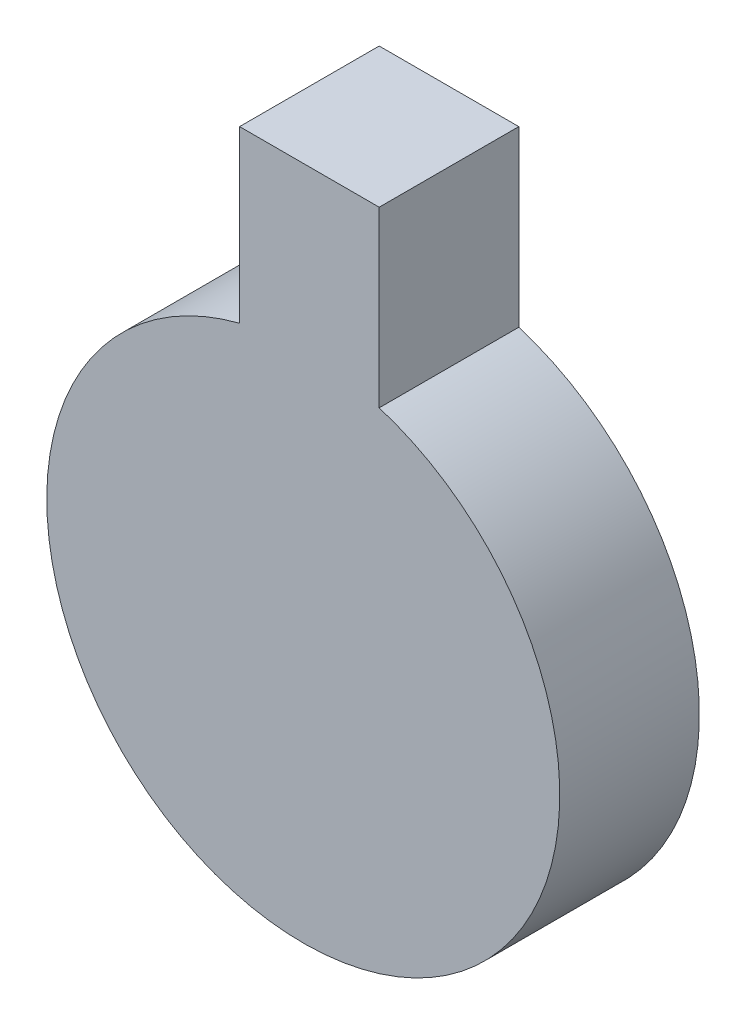
ISO-10303-21;
HEADER;
FILE_DESCRIPTION(('STEP AP214'),'2;1');
FILE_NAME('part.step','',(''),(''),'','','');
FILE_SCHEMA(('AUTOMOTIVE_DESIGN { 1 0 10303 214 1 1 1 1 }'));
ENDSEC;
DATA;
#1=APPLICATION_CONTEXT('core data for automotive mechanical design processes');
#2=APPLICATION_PROTOCOL_DEFINITION('international standard','automotive_design',2000,#1);
#3=PRODUCT_CONTEXT('',#1,'mechanical');
#4=PRODUCT('Part','Part','',(#3));
#5=PRODUCT_RELATED_PRODUCT_CATEGORY('part','',(#4));
#6=PRODUCT_DEFINITION_FORMATION('','',#4);
#7=PRODUCT_DEFINITION_CONTEXT('part definition',#1,'design');
#8=PRODUCT_DEFINITION('design','',#6,#7);
#9=PRODUCT_DEFINITION_SHAPE('','',#8);
#10=(LENGTH_UNIT() NAMED_UNIT(*) SI_UNIT(.MILLI.,.METRE.));
#11=(NAMED_UNIT(*) PLANE_ANGLE_UNIT() SI_UNIT($,.RADIAN.));
#12=(NAMED_UNIT(*) SI_UNIT($,.STERADIAN.) SOLID_ANGLE_UNIT());
#13=UNCERTAINTY_MEASURE_WITH_UNIT(LENGTH_MEASURE(1.E-05),#10,'distance_accuracy_value','');
#14=(GEOMETRIC_REPRESENTATION_CONTEXT(3) GLOBAL_UNCERTAINTY_ASSIGNED_CONTEXT((#13)) GLOBAL_UNIT_ASSIGNED_CONTEXT((#10,
#11,#12)) REPRESENTATION_CONTEXT('',''));
#15=CARTESIAN_POINT('',(0.,0.,0.));
#16=DIRECTION('',(0.,0.,1.));
#17=DIRECTION('',(1.,0.,0.));
#18=AXIS2_PLACEMENT_3D('',#15,#16,#17);
#19=CARTESIAN_POINT('',(0.,0.,0.04));
#20=DIRECTION('',(0.,0.,-1.));
#21=DIRECTION('',(-1.,0.,0.));
#22=AXIS2_PLACEMENT_3D('',#19,#20,#21);
#23=CYLINDRICAL_SURFACE('',#22,0.0734999995823187);
#24=DIRECTION('',(0.,0.,-1.));
#25=VECTOR('',#24,1.);
#26=CARTESIAN_POINT('',(-0.018243595957756,0.0711998675920889,0.04));
#27=LINE('',#26,#25);
#28=CARTESIAN_POINT('',(-0.018243595957756,0.0711998675920889,-8.94069676149814E-10));
#29=VERTEX_POINT('',#28);
#30=CARTESIAN_POINT('',(-0.018243595957756,0.0711998675920889,0.04));
#31=VERTEX_POINT('',#30);
#32=EDGE_CURVE('E91',#29,#31,#27,.F.);
#33=ORIENTED_EDGE('',*,*,#32,.F.);
#34=CARTESIAN_POINT('',(0.,0.,0.));
#35=DIRECTION('',(0.,0.,1.));
#36=DIRECTION('',(1.,0.,0.));
#37=AXIS2_PLACEMENT_3D('',#34,#35,#36);
#38=CIRCLE('',#37,0.0734999995823187);
#39=CARTESIAN_POINT('',(0.021756404042244,0.0702061879163901,0.));
#40=VERTEX_POINT('',#39);
#41=EDGE_CURVE('E36',#29,#40,#38,.T.);
#42=ORIENTED_EDGE('',*,*,#41,.T.);
#43=DIRECTION('',(0.,0.,-1.));
#44=VECTOR('',#43,1.);
#45=CARTESIAN_POINT('',(0.021756404042244,0.0702061879163901,0.04));
#46=LINE('',#45,#44);
#47=CARTESIAN_POINT('',(0.021756404042244,0.0702061879163901,0.04));
#48=VERTEX_POINT('',#47);
#49=EDGE_CURVE('E50',#48,#40,#46,.T.);
#50=ORIENTED_EDGE('',*,*,#49,.F.);
#51=CARTESIAN_POINT('',(0.,0.,0.04));
#52=DIRECTION('',(0.,0.,1.));
#53=DIRECTION('',(1.,0.,0.));
#54=AXIS2_PLACEMENT_3D('',#51,#52,#53);
#55=CIRCLE('',#54,0.0734999995823187);
#56=EDGE_CURVE('E11',#31,#48,#55,.T.);
#57=ORIENTED_EDGE('',*,*,#56,.F.);
#58=EDGE_LOOP('',(#33,#42,#50,#57));
#59=FACE_BOUND('',#58,.T.);
#60=ADVANCED_FACE('F33',(#59),#23,.T.);
#61=CARTESIAN_POINT('',(0.,0.,0.04));
#62=DIRECTION('',(0.,0.,1.));
#63=DIRECTION('',(1.,0.,0.));
#64=AXIS2_PLACEMENT_3D('',#61,#62,#63);
#65=PLANE('',#64);
#66=ORIENTED_EDGE('',*,*,#56,.T.);
#67=DIRECTION('',(0.,-1.,0.));
#68=VECTOR('',#67,1.);
#69=CARTESIAN_POINT('',(0.021756404042244,0.12,0.0399999991059303));
#70=LINE('',#69,#68);
#71=CARTESIAN_POINT('',(0.021756404042244,0.12,0.0399999991059303));
#72=VERTEX_POINT('',#71);
#73=EDGE_CURVE('E76',#72,#48,#70,.T.);
#74=ORIENTED_EDGE('',*,*,#73,.F.);
#75=DIRECTION('',(1.,0.,0.));
#76=VECTOR('',#75,1.);
#77=CARTESIAN_POINT('',(0.021756404042244,0.12,0.0399999991059303));
#78=LINE('',#77,#76);
#79=CARTESIAN_POINT('',(-0.018243595957756,0.12,0.0399999991059303));
#80=VERTEX_POINT('',#79);
#81=EDGE_CURVE('E70',#80,#72,#78,.T.);
#82=ORIENTED_EDGE('',*,*,#81,.F.);
#83=DIRECTION('',(0.,-1.,0.));
#84=VECTOR('',#83,1.);
#85=CARTESIAN_POINT('',(-0.018243595957756,0.12,0.0399999991059303));
#86=LINE('',#85,#84);
#87=EDGE_CURVE('E74',#80,#31,#86,.T.);
#88=ORIENTED_EDGE('',*,*,#87,.T.);
#89=EDGE_LOOP('',(#66,#74,#82,#88));
#90=FACE_BOUND('',#89,.T.);
#91=ADVANCED_FACE('F72',(#90),#65,.T.);
#92=CARTESIAN_POINT('',(0.,0.,0.));
#93=DIRECTION('',(0.,0.,1.));
#94=DIRECTION('',(1.,0.,0.));
#95=AXIS2_PLACEMENT_3D('',#92,#93,#94);
#96=PLANE('',#95);
#97=ORIENTED_EDGE('',*,*,#41,.F.);
#98=DIRECTION('',(0.,-1.,0.));
#99=VECTOR('',#98,1.);
#100=CARTESIAN_POINT('',(-0.018243595957756,0.12,-8.94069676149814E-10));
#101=LINE('',#100,#99);
#102=CARTESIAN_POINT('',(-0.018243595957756,0.12,-8.94069676149814E-10));
#103=VERTEX_POINT('',#102);
#104=EDGE_CURVE('E104',#103,#29,#101,.T.);
#105=ORIENTED_EDGE('',*,*,#104,.F.);
#106=DIRECTION('',(-1.,0.,0.));
#107=VECTOR('',#106,1.);
#108=CARTESIAN_POINT('',(0.021756404042244,0.12,-8.94069680808495E-10));
#109=LINE('',#108,#107);
#110=CARTESIAN_POINT('',(0.021756404042244,0.12,-8.94069680808495E-10));
#111=VERTEX_POINT('',#110);
#112=EDGE_CURVE('E85',#111,#103,#109,.T.);
#113=ORIENTED_EDGE('',*,*,#112,.F.);
#114=DIRECTION('',(0.,-1.,0.));
#115=VECTOR('',#114,1.);
#116=CARTESIAN_POINT('',(0.021756404042244,0.12,-8.94069680808495E-10));
#117=LINE('',#116,#115);
#118=EDGE_CURVE('E94',#111,#40,#117,.T.);
#119=ORIENTED_EDGE('',*,*,#118,.T.);
#120=EDGE_LOOP('',(#97,#105,#113,#119));
#121=FACE_BOUND('',#120,.T.);
#122=ADVANCED_FACE('F103',(#121),#96,.F.);
#123=CARTESIAN_POINT('',(-0.018243595957756,0.12,-8.94069676149814E-10));
#124=DIRECTION('',(1.,0.,0.));
#125=DIRECTION('',(0.,0.,-1.));
#126=AXIS2_PLACEMENT_3D('',#123,#124,#125);
#127=PLANE('',#126);
#128=ORIENTED_EDGE('',*,*,#104,.T.);
#129=ORIENTED_EDGE('',*,*,#32,.T.);
#130=ORIENTED_EDGE('',*,*,#87,.F.);
#131=DIRECTION('',(0.,0.,1.));
#132=VECTOR('',#131,1.);
#133=CARTESIAN_POINT('',(-0.018243595957756,0.12,-8.94069676149814E-10));
#134=LINE('',#133,#132);
#135=EDGE_CURVE('E80',#103,#80,#134,.T.);
#136=ORIENTED_EDGE('',*,*,#135,.F.);
#137=EDGE_LOOP('',(#128,#129,#130,#136));
#138=FACE_BOUND('',#137,.T.);
#139=ADVANCED_FACE('F90',(#138),#127,.F.);
#140=CARTESIAN_POINT('',(0.021756404042244,0.12,-8.94069680808495E-10));
#141=DIRECTION('',(-1.,0.,0.));
#142=DIRECTION('',(0.,0.,1.));
#143=AXIS2_PLACEMENT_3D('',#140,#141,#142);
#144=PLANE('',#143);
#145=ORIENTED_EDGE('',*,*,#73,.T.);
#146=ORIENTED_EDGE('',*,*,#49,.T.);
#147=ORIENTED_EDGE('',*,*,#118,.F.);
#148=DIRECTION('',(0.,0.,-1.));
#149=VECTOR('',#148,1.);
#150=CARTESIAN_POINT('',(0.021756404042244,0.12,-8.94069680808495E-10));
#151=LINE('',#150,#149);
#152=EDGE_CURVE('E79',#72,#111,#151,.T.);
#153=ORIENTED_EDGE('',*,*,#152,.F.);
#154=EDGE_LOOP('',(#145,#146,#147,#153));
#155=FACE_BOUND('',#154,.T.);
#156=ADVANCED_FACE('F102',(#155),#144,.F.);
#157=CARTESIAN_POINT('',(0.,0.12,0.));
#158=DIRECTION('',(0.,-1.,0.));
#159=DIRECTION('',(0.,0.,-1.));
#160=AXIS2_PLACEMENT_3D('',#157,#158,#159);
#161=PLANE('',#160);
#162=ORIENTED_EDGE('',*,*,#135,.T.);
#163=ORIENTED_EDGE('',*,*,#81,.T.);
#164=ORIENTED_EDGE('',*,*,#152,.T.);
#165=ORIENTED_EDGE('',*,*,#112,.T.);
#166=EDGE_LOOP('',(#162,#163,#164,#165));
#167=FACE_BOUND('',#166,.T.);
#168=ADVANCED_FACE('F83',(#167),#161,.F.);
#169=CLOSED_SHELL('',(#60,#91,#122,#139,#156,#168));
#170=MANIFOLD_SOLID_BREP('B2',#169);
#171=ADVANCED_BREP_SHAPE_REPRESENTATION('',(#18,#170),#14);
#172=SHAPE_DEFINITION_REPRESENTATION(#9,#171);
ENDSEC;
END-ISO-10303-21;
